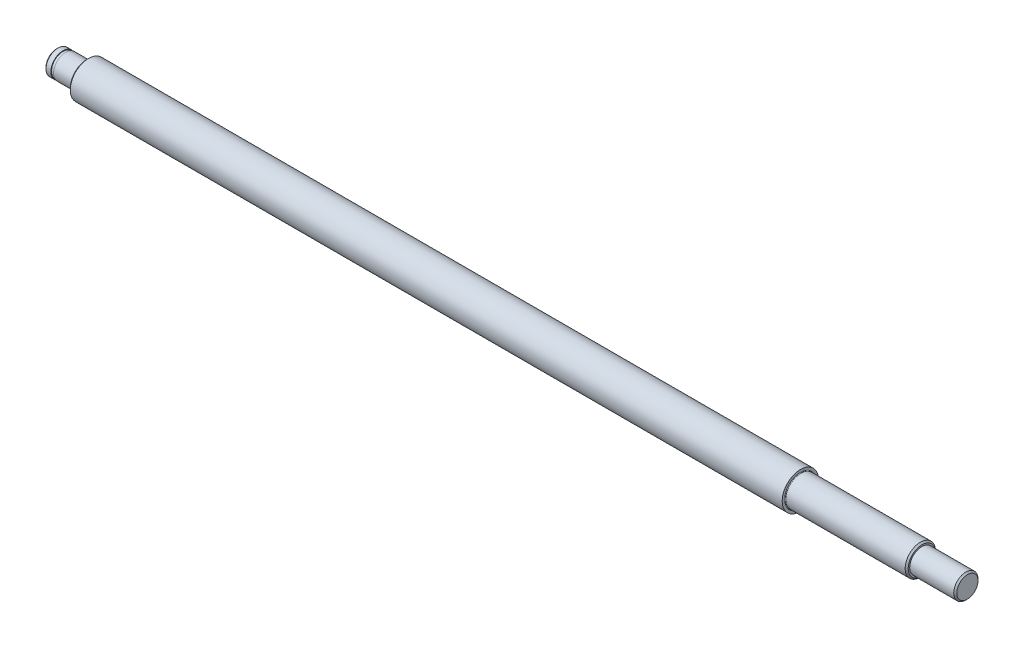
ISO-10303-21;
HEADER;
FILE_DESCRIPTION(('STEP AP214'),'2;1');
FILE_NAME('part.step','',(''),(''),'','','');
FILE_SCHEMA(('AUTOMOTIVE_DESIGN { 1 0 10303 214 1 1 1 1 }'));
ENDSEC;
DATA;
#1=APPLICATION_CONTEXT('core data for automotive mechanical design processes');
#2=APPLICATION_PROTOCOL_DEFINITION('international standard','automotive_design',2000,#1);
#3=PRODUCT_CONTEXT('',#1,'mechanical');
#4=PRODUCT('Part','Part','',(#3));
#5=PRODUCT_RELATED_PRODUCT_CATEGORY('part','',(#4));
#6=PRODUCT_DEFINITION_FORMATION('','',#4);
#7=PRODUCT_DEFINITION_CONTEXT('part definition',#1,'design');
#8=PRODUCT_DEFINITION('design','',#6,#7);
#9=PRODUCT_DEFINITION_SHAPE('','',#8);
#10=(LENGTH_UNIT() NAMED_UNIT(*) SI_UNIT(.MILLI.,.METRE.));
#11=(NAMED_UNIT(*) PLANE_ANGLE_UNIT() SI_UNIT($,.RADIAN.));
#12=(NAMED_UNIT(*) SI_UNIT($,.STERADIAN.) SOLID_ANGLE_UNIT());
#13=UNCERTAINTY_MEASURE_WITH_UNIT(LENGTH_MEASURE(1.E-05),#10,'distance_accuracy_value','');
#14=(GEOMETRIC_REPRESENTATION_CONTEXT(3) GLOBAL_UNCERTAINTY_ASSIGNED_CONTEXT((#13)) GLOBAL_UNIT_ASSIGNED_CONTEXT((#10,
#11,#12)) REPRESENTATION_CONTEXT('',''));
#15=CARTESIAN_POINT('',(0.,0.,0.));
#16=DIRECTION('',(0.,0.,1.));
#17=DIRECTION('',(1.,0.,0.));
#18=AXIS2_PLACEMENT_3D('',#15,#16,#17);
#19=CARTESIAN_POINT('',(235.,3.5,0.));
#20=DIRECTION('',(-1.,0.,0.));
#21=DIRECTION('',(0.,0.,1.));
#22=AXIS2_PLACEMENT_3D('',#19,#20,#21);
#23=PLANE('',#22);
#24=CARTESIAN_POINT('',(235.,0.,0.));
#25=DIRECTION('',(-1.,0.,0.));
#26=DIRECTION('',(0.,0.,1.));
#27=AXIS2_PLACEMENT_3D('',#24,#25,#26);
#28=CIRCLE('',#27,3.5);
#29=CARTESIAN_POINT('',(235.,0.,3.5));
#30=VERTEX_POINT('',#29);
#31=EDGE_CURVE('E10',#30,#30,#28,.T.);
#32=ORIENTED_EDGE('',*,*,#31,.F.);
#33=EDGE_LOOP('',(#32));
#34=FACE_BOUND('',#33,.T.);
#35=ADVANCED_FACE('F15',(#34),#23,.F.);
#36=CARTESIAN_POINT('',(235.,0.,0.));
#37=DIRECTION('',(-1.,0.,0.));
#38=DIRECTION('',(0.,0.,1.));
#39=AXIS2_PLACEMENT_3D('',#36,#37,#38);
#40=CONICAL_SURFACE('',#39,3.5,0.785398163397448);
#41=CARTESIAN_POINT('',(234.5,0.,0.));
#42=DIRECTION('',(-1.,0.,0.));
#43=DIRECTION('',(0.,0.,1.));
#44=AXIS2_PLACEMENT_3D('',#41,#42,#43);
#45=CIRCLE('',#44,4.);
#46=CARTESIAN_POINT('',(234.5,0.,4.));
#47=VERTEX_POINT('',#46);
#48=EDGE_CURVE('E23',#47,#47,#45,.T.);
#49=ORIENTED_EDGE('',*,*,#48,.F.);
#50=EDGE_LOOP('',(#49));
#51=FACE_BOUND('',#50,.T.);
#52=ORIENTED_EDGE('',*,*,#31,.T.);
#53=EDGE_LOOP('',(#52));
#54=FACE_BOUND('',#53,.T.);
#55=ADVANCED_FACE('F127',(#51,#54),#40,.T.);
#56=CARTESIAN_POINT('',(235.,0.,0.));
#57=DIRECTION('',(-1.,0.,0.));
#58=DIRECTION('',(0.,0.,1.));
#59=AXIS2_PLACEMENT_3D('',#56,#57,#58);
#60=CYLINDRICAL_SURFACE('',#59,4.);
#61=CARTESIAN_POINT('',(220.,0.,0.));
#62=DIRECTION('',(-1.,0.,0.));
#63=DIRECTION('',(0.,0.,1.));
#64=AXIS2_PLACEMENT_3D('',#61,#62,#63);
#65=CIRCLE('',#64,4.);
#66=CARTESIAN_POINT('',(220.,0.,4.));
#67=VERTEX_POINT('',#66);
#68=EDGE_CURVE('E28',#67,#67,#65,.T.);
#69=ORIENTED_EDGE('',*,*,#68,.F.);
#70=EDGE_LOOP('',(#69));
#71=FACE_BOUND('',#70,.T.);
#72=ORIENTED_EDGE('',*,*,#48,.T.);
#73=EDGE_LOOP('',(#72));
#74=FACE_BOUND('',#73,.T.);
#75=ADVANCED_FACE('F124',(#71,#74),#60,.T.);
#76=CARTESIAN_POINT('',(220.,4.5,0.));
#77=DIRECTION('',(-1.,0.,0.));
#78=DIRECTION('',(0.,0.,1.));
#79=AXIS2_PLACEMENT_3D('',#76,#77,#78);
#80=PLANE('',#79);
#81=CARTESIAN_POINT('',(220.,0.,0.));
#82=DIRECTION('',(-1.,0.,0.));
#83=DIRECTION('',(0.,0.,1.));
#84=AXIS2_PLACEMENT_3D('',#81,#82,#83);
#85=CIRCLE('',#84,4.5);
#86=CARTESIAN_POINT('',(220.,0.,4.5));
#87=VERTEX_POINT('',#86);
#88=EDGE_CURVE('E117',#87,#87,#85,.T.);
#89=ORIENTED_EDGE('',*,*,#88,.F.);
#90=EDGE_LOOP('',(#89));
#91=FACE_BOUND('',#90,.T.);
#92=ORIENTED_EDGE('',*,*,#68,.T.);
#93=EDGE_LOOP('',(#92));
#94=FACE_BOUND('',#93,.T.);
#95=ADVANCED_FACE('F122',(#91,#94),#80,.F.);
#96=CARTESIAN_POINT('',(220.,0.,0.));
#97=DIRECTION('',(-1.,0.,0.));
#98=DIRECTION('',(0.,0.,1.));
#99=AXIS2_PLACEMENT_3D('',#96,#97,#98);
#100=CONICAL_SURFACE('',#99,4.5,0.785398163397448);
#101=CARTESIAN_POINT('',(219.5,0.,0.));
#102=DIRECTION('',(-1.,0.,0.));
#103=DIRECTION('',(0.,0.,1.));
#104=AXIS2_PLACEMENT_3D('',#101,#102,#103);
#105=CIRCLE('',#104,5.);
#106=CARTESIAN_POINT('',(219.5,0.,5.));
#107=VERTEX_POINT('',#106);
#108=EDGE_CURVE('E114',#107,#107,#105,.T.);
#109=ORIENTED_EDGE('',*,*,#108,.F.);
#110=EDGE_LOOP('',(#109));
#111=FACE_BOUND('',#110,.T.);
#112=ORIENTED_EDGE('',*,*,#88,.T.);
#113=EDGE_LOOP('',(#112));
#114=FACE_BOUND('',#113,.T.);
#115=ADVANCED_FACE('F173',(#111,#114),#100,.T.);
#116=CARTESIAN_POINT('',(235.,0.,0.));
#117=DIRECTION('',(-1.,0.,0.));
#118=DIRECTION('',(0.,0.,1.));
#119=AXIS2_PLACEMENT_3D('',#116,#117,#118);
#120=CYLINDRICAL_SURFACE('',#119,5.);
#121=CARTESIAN_POINT('',(180.2,0.,0.));
#122=DIRECTION('',(-1.,0.,0.));
#123=DIRECTION('',(0.,0.,1.));
#124=AXIS2_PLACEMENT_3D('',#121,#122,#123);
#125=CIRCLE('',#124,5.);
#126=CARTESIAN_POINT('',(180.2,0.,5.));
#127=VERTEX_POINT('',#126);
#128=EDGE_CURVE('E109',#127,#127,#125,.T.);
#129=ORIENTED_EDGE('',*,*,#128,.F.);
#130=EDGE_LOOP('',(#129));
#131=FACE_BOUND('',#130,.T.);
#132=ORIENTED_EDGE('',*,*,#108,.T.);
#133=EDGE_LOOP('',(#132));
#134=FACE_BOUND('',#133,.T.);
#135=ADVANCED_FACE('F169',(#131,#134),#120,.T.);
#136=CARTESIAN_POINT('',(180.199999999995,0.,0.));
#137=DIRECTION('',(-1.,0.,0.));
#138=DIRECTION('',(0.,0.,1.));
#139=AXIS2_PLACEMENT_3D('',#136,#137,#138);
#140=TOROIDAL_SURFACE('',#139,5.1999999999954,0.199999999995401);
#141=CARTESIAN_POINT('',(180.,0.,0.));
#142=DIRECTION('',(-1.,0.,0.));
#143=DIRECTION('',(0.,0.,1.));
#144=AXIS2_PLACEMENT_3D('',#141,#142,#143);
#145=CIRCLE('',#144,5.2);
#146=CARTESIAN_POINT('',(180.,0.,5.2));
#147=VERTEX_POINT('',#146);
#148=EDGE_CURVE('E106',#147,#147,#145,.T.);
#149=ORIENTED_EDGE('',*,*,#148,.F.);
#150=EDGE_LOOP('',(#149));
#151=FACE_BOUND('',#150,.T.);
#152=ORIENTED_EDGE('',*,*,#128,.T.);
#153=EDGE_LOOP('',(#152));
#154=FACE_BOUND('',#153,.T.);
#155=ADVANCED_FACE('F166',(#151,#154),#140,.F.);
#156=CARTESIAN_POINT('',(180.,6.,0.));
#157=DIRECTION('',(-1.,0.,0.));
#158=DIRECTION('',(0.,0.,1.));
#159=AXIS2_PLACEMENT_3D('',#156,#157,#158);
#160=PLANE('',#159);
#161=CARTESIAN_POINT('',(180.,0.,0.));
#162=DIRECTION('',(-1.,0.,0.));
#163=DIRECTION('',(0.,0.,1.));
#164=AXIS2_PLACEMENT_3D('',#161,#162,#163);
#165=CIRCLE('',#164,6.);
#166=CARTESIAN_POINT('',(180.,0.,6.));
#167=VERTEX_POINT('',#166);
#168=EDGE_CURVE('E52',#167,#167,#165,.T.);
#169=ORIENTED_EDGE('',*,*,#168,.F.);
#170=EDGE_LOOP('',(#169));
#171=FACE_BOUND('',#170,.T.);
#172=ORIENTED_EDGE('',*,*,#148,.T.);
#173=EDGE_LOOP('',(#172));
#174=FACE_BOUND('',#173,.T.);
#175=ADVANCED_FACE('F101',(#171,#174),#160,.F.);
#176=CARTESIAN_POINT('',(235.,0.,0.));
#177=DIRECTION('',(-1.,0.,0.));
#178=DIRECTION('',(0.,0.,1.));
#179=AXIS2_PLACEMENT_3D('',#176,#177,#178);
#180=CYLINDRICAL_SURFACE('',#179,6.);
#181=CARTESIAN_POINT('',(-54.5,0.,0.));
#182=DIRECTION('',(-1.,0.,0.));
#183=DIRECTION('',(0.,0.,1.));
#184=AXIS2_PLACEMENT_3D('',#181,#182,#183);
#185=CIRCLE('',#184,6.);
#186=CARTESIAN_POINT('',(-54.5,0.,6.));
#187=VERTEX_POINT('',#186);
#188=EDGE_CURVE('E46',#187,#187,#185,.T.);
#189=ORIENTED_EDGE('',*,*,#188,.F.);
#190=EDGE_LOOP('',(#189));
#191=FACE_BOUND('',#190,.T.);
#192=ORIENTED_EDGE('',*,*,#168,.T.);
#193=EDGE_LOOP('',(#192));
#194=FACE_BOUND('',#193,.T.);
#195=ADVANCED_FACE('F96',(#191,#194),#180,.T.);
#196=CARTESIAN_POINT('',(-54.5,0.,0.));
#197=DIRECTION('',(1.,0.,0.));
#198=DIRECTION('',(0.,0.,-1.));
#199=AXIS2_PLACEMENT_3D('',#196,#197,#198);
#200=CONICAL_SURFACE('',#199,6.,0.785398163397448);
#201=CARTESIAN_POINT('',(-55.,0.,0.));
#202=DIRECTION('',(-1.,0.,0.));
#203=DIRECTION('',(0.,0.,1.));
#204=AXIS2_PLACEMENT_3D('',#201,#202,#203);
#205=CIRCLE('',#204,5.5);
#206=CARTESIAN_POINT('',(-55.,0.,5.5));
#207=VERTEX_POINT('',#206);
#208=EDGE_CURVE('E42',#207,#207,#205,.T.);
#209=ORIENTED_EDGE('',*,*,#208,.F.);
#210=EDGE_LOOP('',(#209));
#211=FACE_BOUND('',#210,.T.);
#212=ORIENTED_EDGE('',*,*,#188,.T.);
#213=EDGE_LOOP('',(#212));
#214=FACE_BOUND('',#213,.T.);
#215=ADVANCED_FACE('F91',(#211,#214),#200,.T.);
#216=CARTESIAN_POINT('',(-55.,4.2,0.));
#217=DIRECTION('',(1.,0.,0.));
#218=DIRECTION('',(0.,0.,-1.));
#219=AXIS2_PLACEMENT_3D('',#216,#217,#218);
#220=PLANE('',#219);
#221=CARTESIAN_POINT('',(-55.,0.,0.));
#222=DIRECTION('',(-1.,0.,0.));
#223=DIRECTION('',(0.,0.,1.));
#224=AXIS2_PLACEMENT_3D('',#221,#222,#223);
#225=CIRCLE('',#224,4.2);
#226=CARTESIAN_POINT('',(-55.,0.,4.2));
#227=VERTEX_POINT('',#226);
#228=EDGE_CURVE('E39',#227,#227,#225,.T.);
#229=ORIENTED_EDGE('',*,*,#228,.F.);
#230=EDGE_LOOP('',(#229));
#231=FACE_BOUND('',#230,.T.);
#232=ORIENTED_EDGE('',*,*,#208,.T.);
#233=EDGE_LOOP('',(#232));
#234=FACE_BOUND('',#233,.T.);
#235=ADVANCED_FACE('F17',(#231,#234),#220,.F.);
#236=CARTESIAN_POINT('',(-55.2,0.,0.));
#237=DIRECTION('',(-1.,0.,0.));
#238=DIRECTION('',(0.,0.,1.));
#239=AXIS2_PLACEMENT_3D('',#236,#237,#238);
#240=TOROIDAL_SURFACE('',#239,4.2,0.200000000000032);
#241=CARTESIAN_POINT('',(-55.2,0.,0.));
#242=DIRECTION('',(-1.,0.,0.));
#243=DIRECTION('',(0.,0.,1.));
#244=AXIS2_PLACEMENT_3D('',#241,#242,#243);
#245=CIRCLE('',#244,4.);
#246=CARTESIAN_POINT('',(-55.2,0.,4.));
#247=VERTEX_POINT('',#246);
#248=EDGE_CURVE('E43',#247,#247,#245,.T.);
#249=ORIENTED_EDGE('',*,*,#248,.F.);
#250=EDGE_LOOP('',(#249));
#251=FACE_BOUND('',#250,.T.);
#252=ORIENTED_EDGE('',*,*,#228,.T.);
#253=EDGE_LOOP('',(#252));
#254=FACE_BOUND('',#253,.T.);
#255=ADVANCED_FACE('F80',(#251,#254),#240,.F.);
#256=CARTESIAN_POINT('',(235.,0.,0.));
#257=DIRECTION('',(-1.,0.,0.));
#258=DIRECTION('',(0.,0.,1.));
#259=AXIS2_PLACEMENT_3D('',#256,#257,#258);
#260=CYLINDRICAL_SURFACE('',#259,4.);
#261=CARTESIAN_POINT('',(-62.,0.,0.));
#262=DIRECTION('',(-1.,0.,0.));
#263=DIRECTION('',(0.,0.,1.));
#264=AXIS2_PLACEMENT_3D('',#261,#262,#263);
#265=CIRCLE('',#264,4.);
#266=CARTESIAN_POINT('',(-62.,0.,4.));
#267=VERTEX_POINT('',#266);
#268=EDGE_CURVE('E49',#267,#267,#265,.T.);
#269=ORIENTED_EDGE('',*,*,#268,.F.);
#270=EDGE_LOOP('',(#269));
#271=FACE_BOUND('',#270,.T.);
#272=ORIENTED_EDGE('',*,*,#248,.T.);
#273=EDGE_LOOP('',(#272));
#274=FACE_BOUND('',#273,.T.);
#275=ADVANCED_FACE('F74',(#271,#274),#260,.T.);
#276=CARTESIAN_POINT('',(-62.,3.8,0.));
#277=DIRECTION('',(1.,0.,0.));
#278=DIRECTION('',(0.,0.,-1.));
#279=AXIS2_PLACEMENT_3D('',#276,#277,#278);
#280=PLANE('',#279);
#281=CARTESIAN_POINT('',(-62.,0.,0.));
#282=DIRECTION('',(-1.,0.,0.));
#283=DIRECTION('',(0.,0.,1.));
#284=AXIS2_PLACEMENT_3D('',#281,#282,#283);
#285=CIRCLE('',#284,3.8);
#286=CARTESIAN_POINT('',(-62.,0.,3.8));
#287=VERTEX_POINT('',#286);
#288=EDGE_CURVE('E53',#287,#287,#285,.T.);
#289=ORIENTED_EDGE('',*,*,#288,.F.);
#290=EDGE_LOOP('',(#289));
#291=FACE_BOUND('',#290,.T.);
#292=ORIENTED_EDGE('',*,*,#268,.T.);
#293=EDGE_LOOP('',(#292));
#294=FACE_BOUND('',#293,.T.);
#295=ADVANCED_FACE('F68',(#291,#294),#280,.F.);
#296=CARTESIAN_POINT('',(235.,0.,0.));
#297=DIRECTION('',(-1.,0.,0.));
#298=DIRECTION('',(0.,0.,1.));
#299=AXIS2_PLACEMENT_3D('',#296,#297,#298);
#300=CYLINDRICAL_SURFACE('',#299,3.8);
#301=CARTESIAN_POINT('',(-62.9,0.,0.));
#302=DIRECTION('',(-1.,0.,0.));
#303=DIRECTION('',(0.,0.,1.));
#304=AXIS2_PLACEMENT_3D('',#301,#302,#303);
#305=CIRCLE('',#304,3.8);
#306=CARTESIAN_POINT('',(-62.9,0.,3.8));
#307=VERTEX_POINT('',#306);
#308=EDGE_CURVE('E19',#307,#307,#305,.T.);
#309=ORIENTED_EDGE('',*,*,#308,.F.);
#310=EDGE_LOOP('',(#309));
#311=FACE_BOUND('',#310,.T.);
#312=ORIENTED_EDGE('',*,*,#288,.T.);
#313=EDGE_LOOP('',(#312));
#314=FACE_BOUND('',#313,.T.);
#315=ADVANCED_FACE('F65',(#311,#314),#300,.T.);
#316=CARTESIAN_POINT('',(-62.9,4.,0.));
#317=DIRECTION('',(-1.,0.,0.));
#318=DIRECTION('',(0.,0.,1.));
#319=AXIS2_PLACEMENT_3D('',#316,#317,#318);
#320=PLANE('',#319);
#321=CARTESIAN_POINT('',(-62.9,0.,0.));
#322=DIRECTION('',(-1.,0.,0.));
#323=DIRECTION('',(0.,0.,1.));
#324=AXIS2_PLACEMENT_3D('',#321,#322,#323);
#325=CIRCLE('',#324,4.);
#326=CARTESIAN_POINT('',(-62.9,0.,4.));
#327=VERTEX_POINT('',#326);
#328=EDGE_CURVE('E38',#327,#327,#325,.T.);
#329=ORIENTED_EDGE('',*,*,#328,.F.);
#330=EDGE_LOOP('',(#329));
#331=FACE_BOUND('',#330,.T.);
#332=ORIENTED_EDGE('',*,*,#308,.T.);
#333=EDGE_LOOP('',(#332));
#334=FACE_BOUND('',#333,.T.);
#335=ADVANCED_FACE('F63',(#331,#334),#320,.F.);
#336=CARTESIAN_POINT('',(235.,0.,0.));
#337=DIRECTION('',(-1.,0.,0.));
#338=DIRECTION('',(0.,0.,1.));
#339=AXIS2_PLACEMENT_3D('',#336,#337,#338);
#340=CYLINDRICAL_SURFACE('',#339,4.);
#341=CARTESIAN_POINT('',(-64.5,0.,0.));
#342=DIRECTION('',(-1.,0.,0.));
#343=DIRECTION('',(0.,0.,1.));
#344=AXIS2_PLACEMENT_3D('',#341,#342,#343);
#345=CIRCLE('',#344,4.);
#346=CARTESIAN_POINT('',(-64.5,0.,4.));
#347=VERTEX_POINT('',#346);
#348=EDGE_CURVE('E35',#347,#347,#345,.T.);
#349=ORIENTED_EDGE('',*,*,#348,.F.);
#350=EDGE_LOOP('',(#349));
#351=FACE_BOUND('',#350,.T.);
#352=ORIENTED_EDGE('',*,*,#328,.T.);
#353=EDGE_LOOP('',(#352));
#354=FACE_BOUND('',#353,.T.);
#355=ADVANCED_FACE('F149',(#351,#354),#340,.T.);
#356=CARTESIAN_POINT('',(-64.5,0.,0.));
#357=DIRECTION('',(1.,0.,0.));
#358=DIRECTION('',(0.,0.,-1.));
#359=AXIS2_PLACEMENT_3D('',#356,#357,#358);
#360=CONICAL_SURFACE('',#359,4.,0.785398163397448);
#361=CARTESIAN_POINT('',(-65.,0.,0.));
#362=DIRECTION('',(-1.,0.,0.));
#363=DIRECTION('',(0.,0.,1.));
#364=AXIS2_PLACEMENT_3D('',#361,#362,#363);
#365=CIRCLE('',#364,3.5);
#366=CARTESIAN_POINT('',(-65.,0.,3.5));
#367=VERTEX_POINT('',#366);
#368=EDGE_CURVE('E32',#367,#367,#365,.T.);
#369=ORIENTED_EDGE('',*,*,#368,.F.);
#370=EDGE_LOOP('',(#369));
#371=FACE_BOUND('',#370,.T.);
#372=ORIENTED_EDGE('',*,*,#348,.T.);
#373=EDGE_LOOP('',(#372));
#374=FACE_BOUND('',#373,.T.);
#375=ADVANCED_FACE('F145',(#371,#374),#360,.T.);
#376=CARTESIAN_POINT('',(-65.,0.,0.));
#377=DIRECTION('',(1.,0.,0.));
#378=DIRECTION('',(0.,0.,-1.));
#379=AXIS2_PLACEMENT_3D('',#376,#377,#378);
#380=PLANE('',#379);
#381=ORIENTED_EDGE('',*,*,#368,.T.);
#382=EDGE_LOOP('',(#381));
#383=FACE_BOUND('',#382,.T.);
#384=ADVANCED_FACE('F142',(#383),#380,.F.);
#385=CLOSED_SHELL('',(#35,#55,#75,#95,#115,#135,#155,#175,#195,#215,#235,#255,#275,#295,#315,
#335,#355,#375,#384));
#386=MANIFOLD_SOLID_BREP('B1',#385);
#387=ADVANCED_BREP_SHAPE_REPRESENTATION('',(#18,#386),#14);
#388=SHAPE_DEFINITION_REPRESENTATION(#9,#387);
ENDSEC;
END-ISO-10303-21;
